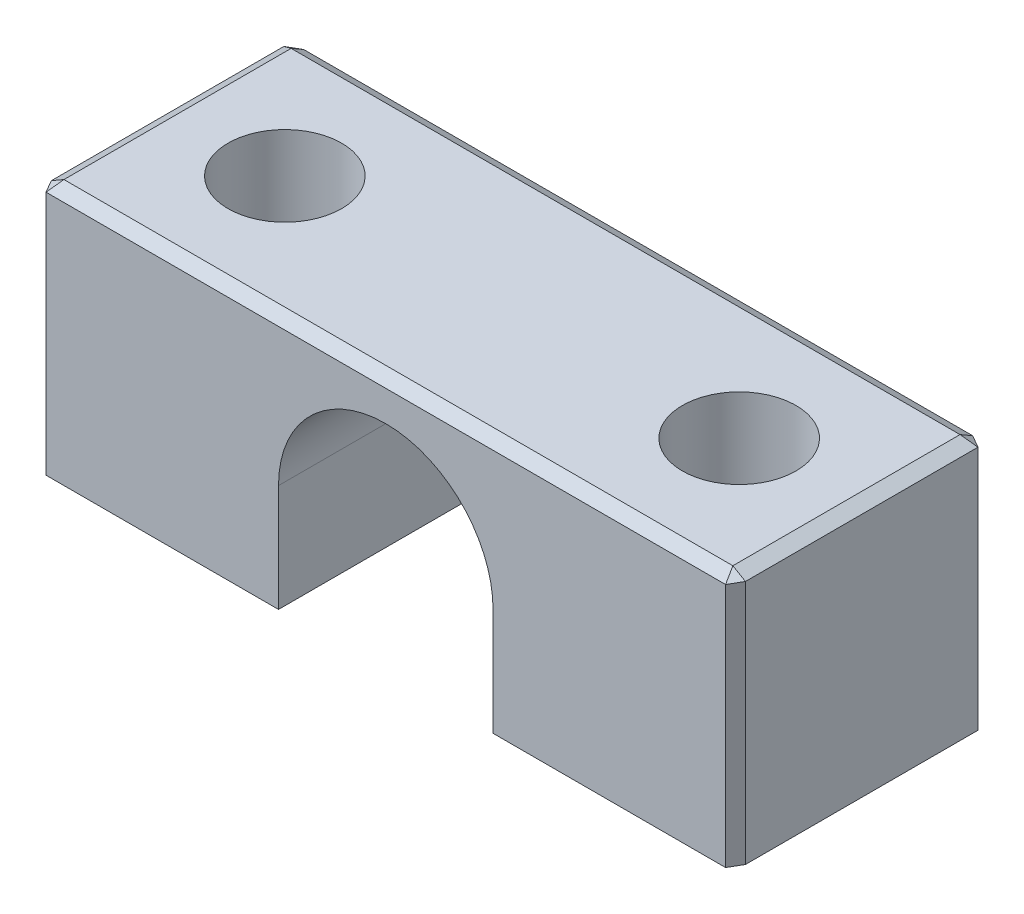
ISO-10303-21;
HEADER;
FILE_DESCRIPTION(('STEP AP214'),'2;1');
FILE_NAME('part.step','',(''),(''),'','','');
FILE_SCHEMA(('AUTOMOTIVE_DESIGN { 1 0 10303 214 1 1 1 1 }'));
ENDSEC;
DATA;
#1=APPLICATION_CONTEXT('core data for automotive mechanical design processes');
#2=APPLICATION_PROTOCOL_DEFINITION('international standard','automotive_design',2000,#1);
#3=PRODUCT_CONTEXT('',#1,'mechanical');
#4=PRODUCT('Part','Part','',(#3));
#5=PRODUCT_RELATED_PRODUCT_CATEGORY('part','',(#4));
#6=PRODUCT_DEFINITION_FORMATION('','',#4);
#7=PRODUCT_DEFINITION_CONTEXT('part definition',#1,'design');
#8=PRODUCT_DEFINITION('design','',#6,#7);
#9=PRODUCT_DEFINITION_SHAPE('','',#8);
#10=(LENGTH_UNIT() NAMED_UNIT(*) SI_UNIT(.MILLI.,.METRE.));
#11=(NAMED_UNIT(*) PLANE_ANGLE_UNIT() SI_UNIT($,.RADIAN.));
#12=(NAMED_UNIT(*) SI_UNIT($,.STERADIAN.) SOLID_ANGLE_UNIT());
#13=UNCERTAINTY_MEASURE_WITH_UNIT(LENGTH_MEASURE(1.E-05),#10,'distance_accuracy_value','');
#14=(GEOMETRIC_REPRESENTATION_CONTEXT(3) GLOBAL_UNCERTAINTY_ASSIGNED_CONTEXT((#13)) GLOBAL_UNIT_ASSIGNED_CONTEXT((#10,
#11,#12)) REPRESENTATION_CONTEXT('',''));
#15=CARTESIAN_POINT('',(0.,0.,0.));
#16=DIRECTION('',(0.,0.,1.));
#17=DIRECTION('',(1.,0.,0.));
#18=AXIS2_PLACEMENT_3D('',#15,#16,#17);
#19=CARTESIAN_POINT('',(27.5,0.,20.));
#20=DIRECTION('',(-1.,0.,0.));
#21=DIRECTION('',(0.,0.,1.));
#22=AXIS2_PLACEMENT_3D('',#19,#20,#21);
#23=PLANE('',#22);
#24=DIRECTION('',(0.,0.,-1.));
#25=VECTOR('',#24,1.);
#26=CARTESIAN_POINT('',(27.5,0.,20.));
#27=LINE('',#26,#25);
#28=CARTESIAN_POINT('',(27.5,0.,19.));
#29=VERTEX_POINT('',#28);
#30=CARTESIAN_POINT('',(27.5,0.,0.577350269189633));
#31=VERTEX_POINT('',#30);
#32=EDGE_CURVE('E183',#29,#31,#27,.T.);
#33=ORIENTED_EDGE('',*,*,#32,.T.);
#34=DIRECTION('',(0.,1.,0.));
#35=VECTOR('',#34,1.);
#36=CARTESIAN_POINT('',(27.5,0.,0.577350269189633));
#37=LINE('',#36,#35);
#38=CARTESIAN_POINT('',(27.5,19.4226497308104,0.577350269189633));
#39=VERTEX_POINT('',#38);
#40=EDGE_CURVE('E208',#31,#39,#37,.T.);
#41=ORIENTED_EDGE('',*,*,#40,.T.);
#42=DIRECTION('',(0.,0.,1.));
#43=VECTOR('',#42,1.);
#44=CARTESIAN_POINT('',(27.5,19.4226497308104,20.));
#45=LINE('',#44,#43);
#46=CARTESIAN_POINT('',(27.5,19.4226497308104,19.));
#47=VERTEX_POINT('',#46);
#48=EDGE_CURVE('E204',#39,#47,#45,.T.);
#49=ORIENTED_EDGE('',*,*,#48,.T.);
#50=DIRECTION('',(0.,-1.,0.));
#51=VECTOR('',#50,1.);
#52=CARTESIAN_POINT('',(27.5,0.,19.));
#53=LINE('',#52,#51);
#54=EDGE_CURVE('E206',#47,#29,#53,.T.);
#55=ORIENTED_EDGE('',*,*,#54,.T.);
#56=EDGE_LOOP('',(#33,#41,#49,#55));
#57=FACE_BOUND('',#56,.T.);
#58=ADVANCED_FACE('F43',(#57),#23,.F.);
#59=CARTESIAN_POINT('',(-27.5,20.,20.));
#60=DIRECTION('',(0.,-1.,0.));
#61=DIRECTION('',(0.,0.,-1.));
#62=AXIS2_PLACEMENT_3D('',#59,#60,#61);
#63=PLANE('',#62);
#64=DIRECTION('',(1.,0.,0.));
#65=VECTOR('',#64,1.);
#66=CARTESIAN_POINT('',(27.5,20.,19.));
#67=LINE('',#66,#65);
#68=CARTESIAN_POINT('',(-26.5,20.,19.));
#69=VERTEX_POINT('',#68);
#70=CARTESIAN_POINT('',(26.5,20.,19.));
#71=VERTEX_POINT('',#70);
#72=EDGE_CURVE('E236',#69,#71,#67,.T.);
#73=ORIENTED_EDGE('',*,*,#72,.T.);
#74=DIRECTION('',(0.,0.,-1.));
#75=VECTOR('',#74,1.);
#76=CARTESIAN_POINT('',(26.5,20.,20.));
#77=LINE('',#76,#75);
#78=CARTESIAN_POINT('',(26.5,20.,1.00000000000001));
#79=VERTEX_POINT('',#78);
#80=EDGE_CURVE('E11',#71,#79,#77,.T.);
#81=ORIENTED_EDGE('',*,*,#80,.T.);
#82=DIRECTION('',(-1.,0.,0.));
#83=VECTOR('',#82,1.);
#84=CARTESIAN_POINT('',(-27.5,20.,1.00000000000001));
#85=LINE('',#84,#83);
#86=CARTESIAN_POINT('',(-26.5,20.,1.00000000000001));
#87=VERTEX_POINT('',#86);
#88=EDGE_CURVE('E53',#79,#87,#85,.T.);
#89=ORIENTED_EDGE('',*,*,#88,.T.);
#90=DIRECTION('',(0.,0.,1.));
#91=VECTOR('',#90,1.);
#92=CARTESIAN_POINT('',(-26.5,20.,20.));
#93=LINE('',#92,#91);
#94=EDGE_CURVE('E238',#87,#69,#93,.T.);
#95=ORIENTED_EDGE('',*,*,#94,.T.);
#96=EDGE_LOOP('',(#73,#81,#89,#95));
#97=FACE_BOUND('',#96,.T.);
#98=CARTESIAN_POINT('',(18.,20.,10.));
#99=DIRECTION('',(0.,-1.,0.));
#100=DIRECTION('',(1.,0.,0.));
#101=AXIS2_PLACEMENT_3D('',#98,#99,#100);
#102=CIRCLE('',#101,4.5);
#103=CARTESIAN_POINT('',(22.5,20.,10.));
#104=VERTEX_POINT('',#103);
#105=EDGE_CURVE('E278',#104,#104,#102,.T.);
#106=ORIENTED_EDGE('',*,*,#105,.T.);
#107=EDGE_LOOP('',(#106));
#108=FACE_BOUND('',#107,.T.);
#109=CARTESIAN_POINT('',(-18.,20.,10.));
#110=DIRECTION('',(0.,-1.,0.));
#111=DIRECTION('',(1.,0.,0.));
#112=AXIS2_PLACEMENT_3D('',#109,#110,#111);
#113=CIRCLE('',#112,4.5);
#114=CARTESIAN_POINT('',(-13.5,20.,10.));
#115=VERTEX_POINT('',#114);
#116=EDGE_CURVE('E186',#115,#115,#113,.T.);
#117=ORIENTED_EDGE('',*,*,#116,.T.);
#118=EDGE_LOOP('',(#117));
#119=FACE_BOUND('',#118,.T.);
#120=ADVANCED_FACE('F302',(#97,#108,#119),#63,.F.);
#121=CARTESIAN_POINT('',(-27.5,0.,20.));
#122=DIRECTION('',(1.,0.,0.));
#123=DIRECTION('',(0.,0.,-1.));
#124=AXIS2_PLACEMENT_3D('',#121,#122,#123);
#125=PLANE('',#124);
#126=DIRECTION('',(0.,0.,-1.));
#127=VECTOR('',#126,1.);
#128=CARTESIAN_POINT('',(-27.5,19.4226497308104,20.));
#129=LINE('',#128,#127);
#130=CARTESIAN_POINT('',(-27.5,19.4226497308104,19.));
#131=VERTEX_POINT('',#130);
#132=CARTESIAN_POINT('',(-27.5,19.4226497308104,0.577350269189633));
#133=VERTEX_POINT('',#132);
#134=EDGE_CURVE('E221',#131,#133,#129,.T.);
#135=ORIENTED_EDGE('',*,*,#134,.T.);
#136=DIRECTION('',(0.,-1.,0.));
#137=VECTOR('',#136,1.);
#138=CARTESIAN_POINT('',(-27.5,0.,0.577350269189633));
#139=LINE('',#138,#137);
#140=CARTESIAN_POINT('',(-27.5,0.,0.577350269189633));
#141=VERTEX_POINT('',#140);
#142=EDGE_CURVE('E225',#133,#141,#139,.T.);
#143=ORIENTED_EDGE('',*,*,#142,.T.);
#144=DIRECTION('',(0.,0.,-1.));
#145=VECTOR('',#144,1.);
#146=CARTESIAN_POINT('',(-27.5,0.,20.));
#147=LINE('',#146,#145);
#148=CARTESIAN_POINT('',(-27.5,0.,19.));
#149=VERTEX_POINT('',#148);
#150=EDGE_CURVE('E167',#149,#141,#147,.T.);
#151=ORIENTED_EDGE('',*,*,#150,.F.);
#152=DIRECTION('',(0.,1.,0.));
#153=VECTOR('',#152,1.);
#154=CARTESIAN_POINT('',(-27.5,20.,19.));
#155=LINE('',#154,#153);
#156=EDGE_CURVE('E223',#149,#131,#155,.T.);
#157=ORIENTED_EDGE('',*,*,#156,.T.);
#158=EDGE_LOOP('',(#135,#143,#151,#157));
#159=FACE_BOUND('',#158,.T.);
#160=ADVANCED_FACE('F293',(#159),#125,.F.);
#161=CARTESIAN_POINT('',(-8.5,0.,20.));
#162=DIRECTION('',(0.,1.,0.));
#163=DIRECTION('',(-1.,0.,0.));
#164=AXIS2_PLACEMENT_3D('',#161,#162,#163);
#165=PLANE('',#164);
#166=CARTESIAN_POINT('',(-18.,0.,10.));
#167=DIRECTION('',(0.,-1.,0.));
#168=DIRECTION('',(1.,0.,0.));
#169=AXIS2_PLACEMENT_3D('',#166,#167,#168);
#170=CIRCLE('',#169,4.5);
#171=CARTESIAN_POINT('',(-13.5,0.,10.));
#172=VERTEX_POINT('',#171);
#173=EDGE_CURVE('E283',#172,#172,#170,.T.);
#174=ORIENTED_EDGE('',*,*,#173,.F.);
#175=EDGE_LOOP('',(#174));
#176=FACE_BOUND('',#175,.T.);
#177=ORIENTED_EDGE('',*,*,#150,.T.);
#178=DIRECTION('',(-0.866025403784439,0.,0.499999999999999));
#179=VECTOR('',#178,1.);
#180=CARTESIAN_POINT('',(-27.5,0.,0.577350269189633));
#181=LINE('',#180,#179);
#182=CARTESIAN_POINT('',(-26.5,0.,0.));
#183=VERTEX_POINT('',#182);
#184=EDGE_CURVE('E229',#141,#183,#181,.F.);
#185=ORIENTED_EDGE('',*,*,#184,.T.);
#186=DIRECTION('',(1.,0.,0.));
#187=VECTOR('',#186,1.);
#188=CARTESIAN_POINT('',(-8.5,0.,0.));
#189=LINE('',#188,#187);
#190=CARTESIAN_POINT('',(-8.5,0.,0.));
#191=VERTEX_POINT('',#190);
#192=EDGE_CURVE('E164',#183,#191,#189,.T.);
#193=ORIENTED_EDGE('',*,*,#192,.T.);
#194=DIRECTION('',(0.,0.,-1.));
#195=VECTOR('',#194,1.);
#196=CARTESIAN_POINT('',(-8.5,0.,20.));
#197=LINE('',#196,#195);
#198=CARTESIAN_POINT('',(-8.5,0.,20.));
#199=VERTEX_POINT('',#198);
#200=EDGE_CURVE('E160',#199,#191,#197,.T.);
#201=ORIENTED_EDGE('',*,*,#200,.F.);
#202=DIRECTION('',(1.,0.,0.));
#203=VECTOR('',#202,1.);
#204=CARTESIAN_POINT('',(-8.5,0.,20.));
#205=LINE('',#204,#203);
#206=CARTESIAN_POINT('',(-26.9226497308104,0.,20.));
#207=VERTEX_POINT('',#206);
#208=EDGE_CURVE('E147',#207,#199,#205,.T.);
#209=ORIENTED_EDGE('',*,*,#208,.F.);
#210=DIRECTION('',(-0.499999999999999,0.,-0.866025403784439));
#211=VECTOR('',#210,1.);
#212=CARTESIAN_POINT('',(-26.9226497308104,0.,20.));
#213=LINE('',#212,#211);
#214=EDGE_CURVE('E227',#207,#149,#213,.T.);
#215=ORIENTED_EDGE('',*,*,#214,.T.);
#216=EDGE_LOOP('',(#177,#185,#193,#201,#209,#215));
#217=FACE_BOUND('',#216,.T.);
#218=ADVANCED_FACE('F162',(#176,#217),#165,.F.);
#219=CARTESIAN_POINT('',(-8.5,8.5,20.));
#220=DIRECTION('',(-1.,0.,0.));
#221=DIRECTION('',(0.,0.,1.));
#222=AXIS2_PLACEMENT_3D('',#219,#220,#221);
#223=PLANE('',#222);
#224=DIRECTION('',(0.,1.,0.));
#225=VECTOR('',#224,1.);
#226=CARTESIAN_POINT('',(-8.5,8.5,0.));
#227=LINE('',#226,#225);
#228=CARTESIAN_POINT('',(-8.5,8.5,0.));
#229=VERTEX_POINT('',#228);
#230=EDGE_CURVE('E185',#191,#229,#227,.T.);
#231=ORIENTED_EDGE('',*,*,#230,.T.);
#232=DIRECTION('',(0.,0.,-1.));
#233=VECTOR('',#232,1.);
#234=CARTESIAN_POINT('',(-8.5,8.5,20.));
#235=LINE('',#234,#233);
#236=CARTESIAN_POINT('',(-8.5,8.5,20.));
#237=VERTEX_POINT('',#236);
#238=EDGE_CURVE('E168',#237,#229,#235,.T.);
#239=ORIENTED_EDGE('',*,*,#238,.F.);
#240=DIRECTION('',(0.,1.,0.));
#241=VECTOR('',#240,1.);
#242=CARTESIAN_POINT('',(-8.5,8.5,20.));
#243=LINE('',#242,#241);
#244=EDGE_CURVE('E151',#199,#237,#243,.T.);
#245=ORIENTED_EDGE('',*,*,#244,.F.);
#246=ORIENTED_EDGE('',*,*,#200,.T.);
#247=EDGE_LOOP('',(#231,#239,#245,#246));
#248=FACE_BOUND('',#247,.T.);
#249=ADVANCED_FACE('F170',(#248),#223,.F.);
#250=CARTESIAN_POINT('',(0.,8.5,20.));
#251=DIRECTION('',(0.,0.,-1.));
#252=DIRECTION('',(-1.,0.,0.));
#253=AXIS2_PLACEMENT_3D('',#250,#251,#252);
#254=CYLINDRICAL_SURFACE('',#253,8.5);
#255=CARTESIAN_POINT('',(0.,8.5,0.));
#256=DIRECTION('',(0.,0.,-1.));
#257=DIRECTION('',(1.,0.,0.));
#258=AXIS2_PLACEMENT_3D('',#255,#256,#257);
#259=CIRCLE('',#258,8.5);
#260=CARTESIAN_POINT('',(8.5,8.5,0.));
#261=VERTEX_POINT('',#260);
#262=EDGE_CURVE('E188',#229,#261,#259,.T.);
#263=ORIENTED_EDGE('',*,*,#262,.T.);
#264=DIRECTION('',(0.,0.,-1.));
#265=VECTOR('',#264,1.);
#266=CARTESIAN_POINT('',(8.5,8.5,20.));
#267=LINE('',#266,#265);
#268=CARTESIAN_POINT('',(8.5,8.5,20.));
#269=VERTEX_POINT('',#268);
#270=EDGE_CURVE('E199',#269,#261,#267,.T.);
#271=ORIENTED_EDGE('',*,*,#270,.F.);
#272=CARTESIAN_POINT('',(0.,8.5,20.));
#273=DIRECTION('',(0.,0.,-1.));
#274=DIRECTION('',(1.,0.,0.));
#275=AXIS2_PLACEMENT_3D('',#272,#273,#274);
#276=CIRCLE('',#275,8.5);
#277=EDGE_CURVE('E173',#237,#269,#276,.T.);
#278=ORIENTED_EDGE('',*,*,#277,.F.);
#279=ORIENTED_EDGE('',*,*,#238,.T.);
#280=EDGE_LOOP('',(#263,#271,#278,#279));
#281=FACE_BOUND('',#280,.T.);
#282=ADVANCED_FACE('F300',(#281),#254,.F.);
#283=CARTESIAN_POINT('',(8.5,8.5,20.));
#284=DIRECTION('',(1.,0.,0.));
#285=DIRECTION('',(0.,0.,-1.));
#286=AXIS2_PLACEMENT_3D('',#283,#284,#285);
#287=PLANE('',#286);
#288=DIRECTION('',(0.,-1.,0.));
#289=VECTOR('',#288,1.);
#290=CARTESIAN_POINT('',(8.5,8.5,0.));
#291=LINE('',#290,#289);
#292=CARTESIAN_POINT('',(8.5,0.,0.));
#293=VERTEX_POINT('',#292);
#294=EDGE_CURVE('E190',#261,#293,#291,.T.);
#295=ORIENTED_EDGE('',*,*,#294,.T.);
#296=DIRECTION('',(0.,0.,-1.));
#297=VECTOR('',#296,1.);
#298=CARTESIAN_POINT('',(8.5,0.,20.));
#299=LINE('',#298,#297);
#300=CARTESIAN_POINT('',(8.5,0.,20.));
#301=VERTEX_POINT('',#300);
#302=EDGE_CURVE('E196',#301,#293,#299,.T.);
#303=ORIENTED_EDGE('',*,*,#302,.F.);
#304=DIRECTION('',(0.,-1.,0.));
#305=VECTOR('',#304,1.);
#306=CARTESIAN_POINT('',(8.5,8.5,20.));
#307=LINE('',#306,#305);
#308=EDGE_CURVE('E175',#269,#301,#307,.T.);
#309=ORIENTED_EDGE('',*,*,#308,.F.);
#310=ORIENTED_EDGE('',*,*,#270,.T.);
#311=EDGE_LOOP('',(#295,#303,#309,#310));
#312=FACE_BOUND('',#311,.T.);
#313=ADVANCED_FACE('F411',(#312),#287,.F.);
#314=CARTESIAN_POINT('',(8.5,0.,20.));
#315=DIRECTION('',(0.,1.,0.));
#316=DIRECTION('',(-1.,0.,0.));
#317=AXIS2_PLACEMENT_3D('',#314,#315,#316);
#318=PLANE('',#317);
#319=CARTESIAN_POINT('',(18.,0.,10.));
#320=DIRECTION('',(0.,-1.,0.));
#321=DIRECTION('',(1.,0.,0.));
#322=AXIS2_PLACEMENT_3D('',#319,#320,#321);
#323=CIRCLE('',#322,4.5);
#324=CARTESIAN_POINT('',(22.5,0.,10.));
#325=VERTEX_POINT('',#324);
#326=EDGE_CURVE('E273',#325,#325,#323,.T.);
#327=ORIENTED_EDGE('',*,*,#326,.F.);
#328=EDGE_LOOP('',(#327));
#329=FACE_BOUND('',#328,.T.);
#330=DIRECTION('',(1.,0.,0.));
#331=VECTOR('',#330,1.);
#332=CARTESIAN_POINT('',(8.5,0.,0.));
#333=LINE('',#332,#331);
#334=CARTESIAN_POINT('',(26.5,0.,0.));
#335=VERTEX_POINT('',#334);
#336=EDGE_CURVE('E157',#293,#335,#333,.T.);
#337=ORIENTED_EDGE('',*,*,#336,.T.);
#338=DIRECTION('',(-0.866025403784439,0.,-0.499999999999999));
#339=VECTOR('',#338,1.);
#340=CARTESIAN_POINT('',(27.5,0.,0.577350269189633));
#341=LINE('',#340,#339);
#342=EDGE_CURVE('E219',#335,#31,#341,.F.);
#343=ORIENTED_EDGE('',*,*,#342,.T.);
#344=ORIENTED_EDGE('',*,*,#32,.F.);
#345=DIRECTION('',(-0.499999999999999,0.,0.866025403784439));
#346=VECTOR('',#345,1.);
#347=CARTESIAN_POINT('',(26.9226497308104,0.,20.));
#348=LINE('',#347,#346);
#349=CARTESIAN_POINT('',(26.9226497308104,0.,20.));
#350=VERTEX_POINT('',#349);
#351=EDGE_CURVE('E217',#29,#350,#348,.T.);
#352=ORIENTED_EDGE('',*,*,#351,.T.);
#353=DIRECTION('',(1.,0.,0.));
#354=VECTOR('',#353,1.);
#355=CARTESIAN_POINT('',(8.5,0.,20.));
#356=LINE('',#355,#354);
#357=EDGE_CURVE('E180',#301,#350,#356,.T.);
#358=ORIENTED_EDGE('',*,*,#357,.F.);
#359=ORIENTED_EDGE('',*,*,#302,.T.);
#360=EDGE_LOOP('',(#337,#343,#344,#352,#358,#359));
#361=FACE_BOUND('',#360,.T.);
#362=ADVANCED_FACE('F414',(#329,#361),#318,.F.);
#363=CARTESIAN_POINT('',(0.,8.5,20.));
#364=DIRECTION('',(0.,0.,1.));
#365=DIRECTION('',(1.,0.,0.));
#366=AXIS2_PLACEMENT_3D('',#363,#364,#365);
#367=PLANE('',#366);
#368=DIRECTION('',(-1.,0.,0.));
#369=VECTOR('',#368,1.);
#370=CARTESIAN_POINT('',(-27.5,19.4226497308104,20.));
#371=LINE('',#370,#369);
#372=CARTESIAN_POINT('',(26.9226497308104,19.4226497308104,20.));
#373=VERTEX_POINT('',#372);
#374=CARTESIAN_POINT('',(-26.9226497308104,19.4226497308104,20.));
#375=VERTEX_POINT('',#374);
#376=EDGE_CURVE('E231',#373,#375,#371,.T.);
#377=ORIENTED_EDGE('',*,*,#376,.T.);
#378=DIRECTION('',(0.,-1.,0.));
#379=VECTOR('',#378,1.);
#380=CARTESIAN_POINT('',(-26.9226497308104,0.,20.));
#381=LINE('',#380,#379);
#382=EDGE_CURVE('E154',#375,#207,#381,.T.);
#383=ORIENTED_EDGE('',*,*,#382,.T.);
#384=ORIENTED_EDGE('',*,*,#208,.T.);
#385=ORIENTED_EDGE('',*,*,#244,.T.);
#386=ORIENTED_EDGE('',*,*,#277,.T.);
#387=ORIENTED_EDGE('',*,*,#308,.T.);
#388=ORIENTED_EDGE('',*,*,#357,.T.);
#389=DIRECTION('',(0.,1.,0.));
#390=VECTOR('',#389,1.);
#391=CARTESIAN_POINT('',(26.9226497308104,20.,20.));
#392=LINE('',#391,#390);
#393=EDGE_CURVE('E233',#350,#373,#392,.T.);
#394=ORIENTED_EDGE('',*,*,#393,.T.);
#395=EDGE_LOOP('',(#377,#383,#384,#385,#386,#387,#388,#394));
#396=FACE_BOUND('',#395,.T.);
#397=ADVANCED_FACE('F149',(#396),#367,.T.);
#398=CARTESIAN_POINT('',(0.,8.5,0.));
#399=DIRECTION('',(0.,0.,1.));
#400=DIRECTION('',(1.,0.,0.));
#401=AXIS2_PLACEMENT_3D('',#398,#399,#400);
#402=PLANE('',#401);
#403=DIRECTION('',(1.,0.,0.));
#404=VECTOR('',#403,1.);
#405=CARTESIAN_POINT('',(0.,19.4226497308104,0.));
#406=LINE('',#405,#404);
#407=CARTESIAN_POINT('',(-26.5,19.4226497308104,0.));
#408=VERTEX_POINT('',#407);
#409=CARTESIAN_POINT('',(26.5,19.4226497308104,0.));
#410=VERTEX_POINT('',#409);
#411=EDGE_CURVE('E211',#408,#410,#406,.T.);
#412=ORIENTED_EDGE('',*,*,#411,.T.);
#413=DIRECTION('',(0.,-1.,0.));
#414=VECTOR('',#413,1.);
#415=CARTESIAN_POINT('',(26.5,8.5,0.));
#416=LINE('',#415,#414);
#417=EDGE_CURVE('E215',#410,#335,#416,.T.);
#418=ORIENTED_EDGE('',*,*,#417,.T.);
#419=ORIENTED_EDGE('',*,*,#336,.F.);
#420=ORIENTED_EDGE('',*,*,#294,.F.);
#421=ORIENTED_EDGE('',*,*,#262,.F.);
#422=ORIENTED_EDGE('',*,*,#230,.F.);
#423=ORIENTED_EDGE('',*,*,#192,.F.);
#424=DIRECTION('',(0.,1.,0.));
#425=VECTOR('',#424,1.);
#426=CARTESIAN_POINT('',(-26.5,8.5,0.));
#427=LINE('',#426,#425);
#428=EDGE_CURVE('E213',#183,#408,#427,.T.);
#429=ORIENTED_EDGE('',*,*,#428,.T.);
#430=EDGE_LOOP('',(#412,#418,#419,#420,#421,#422,#423,#429));
#431=FACE_BOUND('',#430,.T.);
#432=ADVANCED_FACE('F401',(#431),#402,.F.);
#433=CARTESIAN_POINT('',(-18.,20.,10.));
#434=DIRECTION('',(0.,-1.,0.));
#435=DIRECTION('',(1.,0.,0.));
#436=AXIS2_PLACEMENT_3D('',#433,#434,#435);
#437=CYLINDRICAL_SURFACE('',#436,4.5);
#438=ORIENTED_EDGE('',*,*,#116,.F.);
#439=EDGE_LOOP('',(#438));
#440=FACE_BOUND('',#439,.T.);
#441=ORIENTED_EDGE('',*,*,#173,.T.);
#442=EDGE_LOOP('',(#441));
#443=FACE_BOUND('',#442,.T.);
#444=ADVANCED_FACE('F290',(#440,#443),#437,.F.);
#445=CARTESIAN_POINT('',(18.,20.,10.));
#446=DIRECTION('',(0.,-1.,0.));
#447=DIRECTION('',(1.,0.,0.));
#448=AXIS2_PLACEMENT_3D('',#445,#446,#447);
#449=CYLINDRICAL_SURFACE('',#448,4.5);
#450=ORIENTED_EDGE('',*,*,#105,.F.);
#451=EDGE_LOOP('',(#450));
#452=FACE_BOUND('',#451,.T.);
#453=ORIENTED_EDGE('',*,*,#326,.T.);
#454=EDGE_LOOP('',(#453));
#455=FACE_BOUND('',#454,.T.);
#456=ADVANCED_FACE('F389',(#452,#455),#449,.F.);
#457=CARTESIAN_POINT('',(-26.9226497308104,8.5,20.));
#458=DIRECTION('',(-0.866025403784439,0.,0.499999999999999));
#459=DIRECTION('',(0.,1.,0.));
#460=AXIS2_PLACEMENT_3D('',#457,#458,#459);
#461=PLANE('',#460);
#462=DIRECTION('',(0.499999999999999,0.,0.866025403784439));
#463=VECTOR('',#462,1.);
#464=CARTESIAN_POINT('',(-27.5,19.4226497308104,19.));
#465=LINE('',#464,#463);
#466=EDGE_CURVE('E48',#131,#375,#465,.T.);
#467=ORIENTED_EDGE('',*,*,#466,.F.);
#468=ORIENTED_EDGE('',*,*,#156,.F.);
#469=ORIENTED_EDGE('',*,*,#214,.F.);
#470=ORIENTED_EDGE('',*,*,#382,.F.);
#471=EDGE_LOOP('',(#467,#468,#469,#470));
#472=FACE_BOUND('',#471,.T.);
#473=ADVANCED_FACE('F46',(#472),#461,.T.);
#474=CARTESIAN_POINT('',(-27.5,19.4226497308104,19.));
#475=DIRECTION('',(-0.480384461415261,0.832050294337844,0.277350098112614));
#476=DIRECTION('',(-0.866025403784439,-0.499999999999999,0.));
#477=AXIS2_PLACEMENT_3D('',#474,#475,#476);
#478=PLANE('',#477);
#479=DIRECTION('',(0.866025403784439,0.499999999999999,0.));
#480=VECTOR('',#479,1.);
#481=CARTESIAN_POINT('',(-27.5,19.4226497308104,19.));
#482=LINE('',#481,#480);
#483=EDGE_CURVE('E264',#131,#69,#482,.T.);
#484=ORIENTED_EDGE('',*,*,#483,.F.);
#485=ORIENTED_EDGE('',*,*,#466,.T.);
#486=DIRECTION('',(0.343723769333441,0.469535400794021,-0.813259170127463));
#487=VECTOR('',#486,1.);
#488=CARTESIAN_POINT('',(-26.7113248654052,19.7113248654052,19.5));
#489=LINE('',#488,#487);
#490=EDGE_CURVE('E266',#69,#375,#489,.F.);
#491=ORIENTED_EDGE('',*,*,#490,.F.);
#492=EDGE_LOOP('',(#484,#485,#491));
#493=FACE_BOUND('',#492,.T.);
#494=ADVANCED_FACE('F381',(#493),#478,.T.);
#495=CARTESIAN_POINT('',(26.9226497308104,8.5,20.));
#496=DIRECTION('',(0.866025403784439,0.,0.499999999999999));
#497=DIRECTION('',(0.,-1.,0.));
#498=AXIS2_PLACEMENT_3D('',#495,#496,#497);
#499=PLANE('',#498);
#500=ORIENTED_EDGE('',*,*,#351,.F.);
#501=ORIENTED_EDGE('',*,*,#54,.F.);
#502=DIRECTION('',(0.499999999999999,0.,-0.866025403784439));
#503=VECTOR('',#502,1.);
#504=CARTESIAN_POINT('',(26.9226497308104,19.4226497308104,20.));
#505=LINE('',#504,#503);
#506=EDGE_CURVE('E261',#373,#47,#505,.T.);
#507=ORIENTED_EDGE('',*,*,#506,.F.);
#508=ORIENTED_EDGE('',*,*,#393,.F.);
#509=EDGE_LOOP('',(#500,#501,#507,#508));
#510=FACE_BOUND('',#509,.T.);
#511=ADVANCED_FACE('F376',(#510),#499,.T.);
#512=CARTESIAN_POINT('',(0.,19.4226497308104,20.));
#513=DIRECTION('',(0.,0.866025403784439,0.499999999999999));
#514=DIRECTION('',(1.,0.,0.));
#515=AXIS2_PLACEMENT_3D('',#512,#513,#514);
#516=PLANE('',#515);
#517=ORIENTED_EDGE('',*,*,#490,.T.);
#518=ORIENTED_EDGE('',*,*,#376,.F.);
#519=DIRECTION('',(0.343723769333441,-0.469535400794021,0.813259170127463));
#520=VECTOR('',#519,1.);
#521=CARTESIAN_POINT('',(26.9226497308104,19.4226497308104,20.));
#522=LINE('',#521,#520);
#523=EDGE_CURVE('E258',#71,#373,#522,.T.);
#524=ORIENTED_EDGE('',*,*,#523,.F.);
#525=ORIENTED_EDGE('',*,*,#72,.F.);
#526=EDGE_LOOP('',(#517,#518,#524,#525));
#527=FACE_BOUND('',#526,.T.);
#528=ADVANCED_FACE('F369',(#527),#516,.T.);
#529=CARTESIAN_POINT('',(-27.5,19.4226497308104,20.));
#530=DIRECTION('',(0.499999999999999,-0.866025403784439,0.));
#531=DIRECTION('',(0.,0.,-1.));
#532=AXIS2_PLACEMENT_3D('',#529,#530,#531);
#533=PLANE('',#532);
#534=ORIENTED_EDGE('',*,*,#483,.T.);
#535=ORIENTED_EDGE('',*,*,#94,.F.);
#536=DIRECTION('',(-0.813259170127463,-0.469535400794021,-0.343723769333441));
#537=VECTOR('',#536,1.);
#538=CARTESIAN_POINT('',(-27.,19.7113248654052,0.788675134594824));
#539=LINE('',#538,#537);
#540=EDGE_CURVE('E255',#133,#87,#539,.F.);
#541=ORIENTED_EDGE('',*,*,#540,.F.);
#542=ORIENTED_EDGE('',*,*,#134,.F.);
#543=EDGE_LOOP('',(#534,#535,#541,#542));
#544=FACE_BOUND('',#543,.T.);
#545=ADVANCED_FACE('F362',(#544),#533,.F.);
#546=CARTESIAN_POINT('',(-27.5,0.,0.577350269189633));
#547=DIRECTION('',(0.499999999999999,0.,0.866025403784439));
#548=DIRECTION('',(0.,-1.,0.));
#549=AXIS2_PLACEMENT_3D('',#546,#547,#548);
#550=PLANE('',#549);
#551=ORIENTED_EDGE('',*,*,#184,.F.);
#552=ORIENTED_EDGE('',*,*,#142,.F.);
#553=DIRECTION('',(0.866025403784439,0.,-0.499999999999999));
#554=VECTOR('',#553,1.);
#555=CARTESIAN_POINT('',(-26.5,19.4226497308104,0.));
#556=LINE('',#555,#554);
#557=EDGE_CURVE('E252',#408,#133,#556,.F.);
#558=ORIENTED_EDGE('',*,*,#557,.F.);
#559=ORIENTED_EDGE('',*,*,#428,.F.);
#560=EDGE_LOOP('',(#551,#552,#558,#559));
#561=FACE_BOUND('',#560,.T.);
#562=ADVANCED_FACE('F355',(#561),#550,.F.);
#563=CARTESIAN_POINT('',(26.9226497308104,19.4226497308104,20.));
#564=DIRECTION('',(0.480384461415261,0.832050294337844,0.277350098112614));
#565=DIRECTION('',(-0.866025403784439,0.499999999999999,0.));
#566=AXIS2_PLACEMENT_3D('',#563,#564,#565);
#567=PLANE('',#566);
#568=ORIENTED_EDGE('',*,*,#523,.T.);
#569=ORIENTED_EDGE('',*,*,#506,.T.);
#570=DIRECTION('',(0.866025403784439,-0.499999999999999,0.));
#571=VECTOR('',#570,1.);
#572=CARTESIAN_POINT('',(27.0669872981078,19.6726497308104,19.));
#573=LINE('',#572,#571);
#574=EDGE_CURVE('E249',#71,#47,#573,.T.);
#575=ORIENTED_EDGE('',*,*,#574,.F.);
#576=EDGE_LOOP('',(#568,#569,#575));
#577=FACE_BOUND('',#576,.T.);
#578=ADVANCED_FACE('F348',(#577),#567,.T.);
#579=CARTESIAN_POINT('',(-26.5,19.4226497308104,0.));
#580=DIRECTION('',(-0.277350098112614,0.832050294337844,-0.480384461415261));
#581=DIRECTION('',(0.,0.499999999999999,0.866025403784439));
#582=AXIS2_PLACEMENT_3D('',#579,#580,#581);
#583=PLANE('',#582);
#584=ORIENTED_EDGE('',*,*,#557,.T.);
#585=ORIENTED_EDGE('',*,*,#540,.T.);
#586=DIRECTION('',(0.,0.499999999999999,0.866025403784439));
#587=VECTOR('',#586,1.);
#588=CARTESIAN_POINT('',(-26.5,19.4226497308104,0.));
#589=LINE('',#588,#587);
#590=EDGE_CURVE('E246',#408,#87,#589,.T.);
#591=ORIENTED_EDGE('',*,*,#590,.F.);
#592=EDGE_LOOP('',(#584,#585,#591));
#593=FACE_BOUND('',#592,.T.);
#594=ADVANCED_FACE('F341',(#593),#583,.T.);
#595=CARTESIAN_POINT('',(26.5,20.,20.));
#596=DIRECTION('',(-0.499999999999999,-0.866025403784439,0.));
#597=DIRECTION('',(0.,0.,-1.));
#598=AXIS2_PLACEMENT_3D('',#595,#596,#597);
#599=PLANE('',#598);
#600=ORIENTED_EDGE('',*,*,#574,.T.);
#601=ORIENTED_EDGE('',*,*,#48,.F.);
#602=DIRECTION('',(-0.813259170127463,0.469535400794021,0.343723769333441));
#603=VECTOR('',#602,1.);
#604=CARTESIAN_POINT('',(27.5,19.4226497308104,0.577350269189633));
#605=LINE('',#604,#603);
#606=EDGE_CURVE('E244',#79,#39,#605,.F.);
#607=ORIENTED_EDGE('',*,*,#606,.F.);
#608=ORIENTED_EDGE('',*,*,#80,.F.);
#609=EDGE_LOOP('',(#600,#601,#607,#608));
#610=FACE_BOUND('',#609,.T.);
#611=ADVANCED_FACE('F334',(#610),#599,.F.);
#612=CARTESIAN_POINT('',(-27.5,20.,1.00000000000001));
#613=DIRECTION('',(0.,-0.866025403784439,0.499999999999999));
#614=DIRECTION('',(-1.,0.,0.));
#615=AXIS2_PLACEMENT_3D('',#612,#613,#614);
#616=PLANE('',#615);
#617=ORIENTED_EDGE('',*,*,#590,.T.);
#618=ORIENTED_EDGE('',*,*,#88,.F.);
#619=DIRECTION('',(0.,-0.499999999999999,-0.866025403784439));
#620=VECTOR('',#619,1.);
#621=CARTESIAN_POINT('',(26.5,19.6726497308104,0.433012701892226));
#622=LINE('',#621,#620);
#623=EDGE_CURVE('E61',#410,#79,#622,.F.);
#624=ORIENTED_EDGE('',*,*,#623,.F.);
#625=ORIENTED_EDGE('',*,*,#411,.F.);
#626=EDGE_LOOP('',(#617,#618,#624,#625));
#627=FACE_BOUND('',#626,.T.);
#628=ADVANCED_FACE('F328',(#627),#616,.F.);
#629=CARTESIAN_POINT('',(27.5,19.4226497308104,0.577350269189633));
#630=DIRECTION('',(0.277350098112614,0.832050294337844,-0.480384461415261));
#631=DIRECTION('',(0.,0.499999999999999,0.866025403784439));
#632=AXIS2_PLACEMENT_3D('',#629,#630,#631);
#633=PLANE('',#632);
#634=ORIENTED_EDGE('',*,*,#623,.T.);
#635=ORIENTED_EDGE('',*,*,#606,.T.);
#636=DIRECTION('',(0.866025403784439,0.,0.499999999999999));
#637=VECTOR('',#636,1.);
#638=CARTESIAN_POINT('',(27.5,19.4226497308104,0.577350269189633));
#639=LINE('',#638,#637);
#640=EDGE_CURVE('E241',#410,#39,#639,.T.);
#641=ORIENTED_EDGE('',*,*,#640,.F.);
#642=EDGE_LOOP('',(#634,#635,#641));
#643=FACE_BOUND('',#642,.T.);
#644=ADVANCED_FACE('F321',(#643),#633,.T.);
#645=CARTESIAN_POINT('',(27.5,0.,0.577350269189633));
#646=DIRECTION('',(-0.499999999999999,0.,0.866025403784439));
#647=DIRECTION('',(0.,1.,0.));
#648=AXIS2_PLACEMENT_3D('',#645,#646,#647);
#649=PLANE('',#648);
#650=ORIENTED_EDGE('',*,*,#342,.F.);
#651=ORIENTED_EDGE('',*,*,#417,.F.);
#652=ORIENTED_EDGE('',*,*,#640,.T.);
#653=ORIENTED_EDGE('',*,*,#40,.F.);
#654=EDGE_LOOP('',(#650,#651,#652,#653));
#655=FACE_BOUND('',#654,.T.);
#656=ADVANCED_FACE('F315',(#655),#649,.F.);
#657=CLOSED_SHELL('',(#58,#120,#160,#218,#249,#282,#313,#362,#397,#432,#444,#456,#473,#494,#511,
#528,#545,#562,#578,#594,#611,#628,#644,#656));
#658=MANIFOLD_SOLID_BREP('B2',#657);
#659=ADVANCED_BREP_SHAPE_REPRESENTATION('',(#18,#658),#14);
#660=SHAPE_DEFINITION_REPRESENTATION(#9,#659);
ENDSEC;
END-ISO-10303-21;
